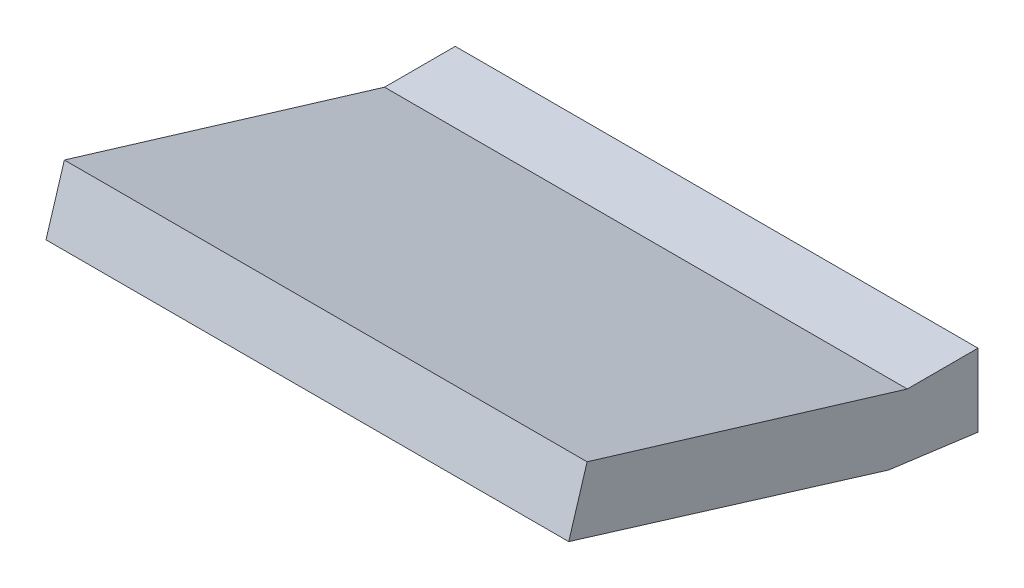
ISO-10303-21;
HEADER;
FILE_DESCRIPTION(('STEP AP214'),'2;1');
FILE_NAME('part.step','',(''),(''),'','','');
FILE_SCHEMA(('AUTOMOTIVE_DESIGN { 1 0 10303 214 1 1 1 1 }'));
ENDSEC;
DATA;
#1=APPLICATION_CONTEXT('core data for automotive mechanical design processes');
#2=APPLICATION_PROTOCOL_DEFINITION('international standard','automotive_design',2000,#1);
#3=PRODUCT_CONTEXT('',#1,'mechanical');
#4=PRODUCT('Part','Part','',(#3));
#5=PRODUCT_RELATED_PRODUCT_CATEGORY('part','',(#4));
#6=PRODUCT_DEFINITION_FORMATION('','',#4);
#7=PRODUCT_DEFINITION_CONTEXT('part definition',#1,'design');
#8=PRODUCT_DEFINITION('design','',#6,#7);
#9=PRODUCT_DEFINITION_SHAPE('','',#8);
#10=(LENGTH_UNIT() NAMED_UNIT(*) SI_UNIT(.MILLI.,.METRE.));
#11=(NAMED_UNIT(*) PLANE_ANGLE_UNIT() SI_UNIT($,.RADIAN.));
#12=(NAMED_UNIT(*) SI_UNIT($,.STERADIAN.) SOLID_ANGLE_UNIT());
#13=UNCERTAINTY_MEASURE_WITH_UNIT(LENGTH_MEASURE(1.E-05),#10,'distance_accuracy_value','');
#14=(GEOMETRIC_REPRESENTATION_CONTEXT(3) GLOBAL_UNCERTAINTY_ASSIGNED_CONTEXT((#13)) GLOBAL_UNIT_ASSIGNED_CONTEXT((#10,
#11,#12)) REPRESENTATION_CONTEXT('',''));
#15=CARTESIAN_POINT('',(0.,0.,0.));
#16=DIRECTION('',(0.,0.,1.));
#17=DIRECTION('',(1.,0.,0.));
#18=AXIS2_PLACEMENT_3D('',#15,#16,#17);
#19=CARTESIAN_POINT('',(31.75,0.,0.));
#20=DIRECTION('',(0.,-0.957016299288306,0.290034140915368));
#21=DIRECTION('',(0.,-0.290034140915368,-0.957016299288306));
#22=AXIS2_PLACEMENT_3D('',#19,#20,#21);
#23=PLANE('',#22);
#24=DIRECTION('',(0.,0.290034140915368,0.957016299288306));
#25=VECTOR('',#24,1.);
#26=CARTESIAN_POINT('',(0.,0.,0.));
#27=LINE('',#26,#25);
#28=CARTESIAN_POINT('',(0.,0.,0.));
#29=VERTEX_POINT('',#28);
#30=CARTESIAN_POINT('',(0.,5.89349374340027,19.4465712015384));
#31=VERTEX_POINT('',#30);
#32=EDGE_CURVE('E119',#29,#31,#27,.T.);
#33=ORIENTED_EDGE('',*,*,#32,.T.);
#34=DIRECTION('',(-1.,0.,0.));
#35=VECTOR('',#34,1.);
#36=CARTESIAN_POINT('',(31.75,5.89349374340027,19.4465712015384));
#37=LINE('',#36,#35);
#38=CARTESIAN_POINT('',(31.75,5.89349374340027,19.4465712015384));
#39=VERTEX_POINT('',#38);
#40=EDGE_CURVE('E11',#39,#31,#37,.T.);
#41=ORIENTED_EDGE('',*,*,#40,.F.);
#42=DIRECTION('',(0.,0.290034140915368,0.957016299288306));
#43=VECTOR('',#42,1.);
#44=CARTESIAN_POINT('',(31.75,0.,0.));
#45=LINE('',#44,#43);
#46=CARTESIAN_POINT('',(31.75,0.,0.));
#47=VERTEX_POINT('',#46);
#48=EDGE_CURVE('E54',#47,#39,#45,.T.);
#49=ORIENTED_EDGE('',*,*,#48,.F.);
#50=DIRECTION('',(-1.,0.,0.));
#51=VECTOR('',#50,1.);
#52=CARTESIAN_POINT('',(31.75,0.,0.));
#53=LINE('',#52,#51);
#54=EDGE_CURVE('E73',#47,#29,#53,.T.);
#55=ORIENTED_EDGE('',*,*,#54,.T.);
#56=EDGE_LOOP('',(#33,#41,#49,#55));
#57=FACE_BOUND('',#56,.T.);
#58=ADVANCED_FACE('F38',(#57),#23,.F.);
#59=CARTESIAN_POINT('',(31.75,5.89349374340027,19.4465712015384));
#60=DIRECTION('',(0.,-0.292700853705509,-0.956204063074439));
#61=DIRECTION('',(0.,0.95620406307444,-0.292700853705509));
#62=AXIS2_PLACEMENT_3D('',#59,#60,#61);
#63=PLANE('',#62);
#64=DIRECTION('',(0.,-0.956204063074439,0.292700853705509));
#65=VECTOR('',#64,1.);
#66=CARTESIAN_POINT('',(0.,5.89349374340027,19.4465712015384));
#67=LINE('',#66,#65);
#68=CARTESIAN_POINT('',(0.,2.25035626308666,20.5617614541564));
#69=VERTEX_POINT('',#68);
#70=EDGE_CURVE('E68',#31,#69,#67,.T.);
#71=ORIENTED_EDGE('',*,*,#70,.T.);
#72=DIRECTION('',(-1.,0.,0.));
#73=VECTOR('',#72,1.);
#74=CARTESIAN_POINT('',(31.75,2.25035626308666,20.5617614541564));
#75=LINE('',#74,#73);
#76=CARTESIAN_POINT('',(31.75,2.25035626308666,20.5617614541564));
#77=VERTEX_POINT('',#76);
#78=EDGE_CURVE('E46',#77,#69,#75,.T.);
#79=ORIENTED_EDGE('',*,*,#78,.F.);
#80=DIRECTION('',(0.,-0.956204063074439,0.292700853705509));
#81=VECTOR('',#80,1.);
#82=CARTESIAN_POINT('',(31.75,5.89349374340027,19.4465712015384));
#83=LINE('',#82,#81);
#84=EDGE_CURVE('E78',#39,#77,#83,.T.);
#85=ORIENTED_EDGE('',*,*,#84,.F.);
#86=ORIENTED_EDGE('',*,*,#40,.T.);
#87=EDGE_LOOP('',(#71,#79,#85,#86));
#88=FACE_BOUND('',#87,.T.);
#89=ADVANCED_FACE('F148',(#88),#63,.F.);
#90=CARTESIAN_POINT('',(31.75,2.25035626308666,20.5617614541564));
#91=DIRECTION('',(0.,0.95620406307444,-0.292700853705508));
#92=DIRECTION('',(0.,0.292700853705508,0.95620406307444));
#93=AXIS2_PLACEMENT_3D('',#90,#91,#92);
#94=PLANE('',#93);
#95=DIRECTION('',(0.,-0.292700853705508,-0.956204063074439));
#96=VECTOR('',#95,1.);
#97=CARTESIAN_POINT('',(0.,2.25035626308666,20.5617614541564));
#98=LINE('',#97,#96);
#99=CARTESIAN_POINT('',(0.,-3.69732508420927,1.13169489248376));
#100=VERTEX_POINT('',#99);
#101=EDGE_CURVE('E111',#69,#100,#98,.T.);
#102=ORIENTED_EDGE('',*,*,#101,.T.);
#103=DIRECTION('',(-1.,0.,0.));
#104=VECTOR('',#103,1.);
#105=CARTESIAN_POINT('',(31.75,-3.69732508420927,1.13169489248376));
#106=LINE('',#105,#104);
#107=CARTESIAN_POINT('',(31.75,-3.69732508420927,1.13169489248376));
#108=VERTEX_POINT('',#107);
#109=EDGE_CURVE('E95',#108,#100,#106,.T.);
#110=ORIENTED_EDGE('',*,*,#109,.F.);
#111=DIRECTION('',(0.,-0.292700853705508,-0.956204063074439));
#112=VECTOR('',#111,1.);
#113=CARTESIAN_POINT('',(31.75,2.25035626308666,20.5617614541564));
#114=LINE('',#113,#112);
#115=EDGE_CURVE('E123',#77,#108,#114,.T.);
#116=ORIENTED_EDGE('',*,*,#115,.F.);
#117=ORIENTED_EDGE('',*,*,#78,.T.);
#118=EDGE_LOOP('',(#102,#110,#116,#117));
#119=FACE_BOUND('',#118,.T.);
#120=ADVANCED_FACE('F116',(#119),#94,.F.);
#121=CARTESIAN_POINT('',(31.75,0.,0.));
#122=DIRECTION('',(1.,0.,0.));
#123=DIRECTION('',(0.,0.,-1.));
#124=AXIS2_PLACEMENT_3D('',#121,#122,#123);
#125=PLANE('',#124);
#126=DIRECTION('',(0.,0.132172696929109,0.991226703729518));
#127=VECTOR('',#126,1.);
#128=CARTESIAN_POINT('',(31.75,-3.78100107696743,0.504168327542374));
#129=LINE('',#128,#127);
#130=CARTESIAN_POINT('',(31.75,-4.42095910010621,-4.29518506797274));
#131=VERTEX_POINT('',#130);
#132=EDGE_CURVE('E101',#131,#108,#129,.T.);
#133=ORIENTED_EDGE('',*,*,#132,.F.);
#134=DIRECTION('',(0.,1.,0.));
#135=VECTOR('',#134,1.);
#136=CARTESIAN_POINT('',(31.75,0.,-4.29518506797274));
#137=LINE('',#136,#135);
#138=CARTESIAN_POINT('',(31.75,0.,-4.29518506797274));
#139=VERTEX_POINT('',#138);
#140=EDGE_CURVE('E129',#131,#139,#137,.T.);
#141=ORIENTED_EDGE('',*,*,#140,.T.);
#142=DIRECTION('',(0.,0.,1.));
#143=VECTOR('',#142,1.);
#144=CARTESIAN_POINT('',(31.75,0.,0.));
#145=LINE('',#144,#143);
#146=EDGE_CURVE('E135',#139,#47,#145,.T.);
#147=ORIENTED_EDGE('',*,*,#146,.T.);
#148=ORIENTED_EDGE('',*,*,#48,.T.);
#149=ORIENTED_EDGE('',*,*,#84,.T.);
#150=ORIENTED_EDGE('',*,*,#115,.T.);
#151=EDGE_LOOP('',(#133,#141,#147,#148,#149,#150));
#152=FACE_BOUND('',#151,.T.);
#153=ADVANCED_FACE('F146',(#152),#125,.T.);
#154=CARTESIAN_POINT('',(0.,0.,0.));
#155=DIRECTION('',(1.,0.,0.));
#156=DIRECTION('',(0.,0.,-1.));
#157=AXIS2_PLACEMENT_3D('',#154,#155,#156);
#158=PLANE('',#157);
#159=DIRECTION('',(0.,1.,0.));
#160=VECTOR('',#159,1.);
#161=CARTESIAN_POINT('',(0.,0.,-4.29518506797274));
#162=LINE('',#161,#160);
#163=CARTESIAN_POINT('',(0.,-4.42095910010621,-4.29518506797274));
#164=VERTEX_POINT('',#163);
#165=CARTESIAN_POINT('',(0.,0.,-4.29518506797274));
#166=VERTEX_POINT('',#165);
#167=EDGE_CURVE('E113',#164,#166,#162,.T.);
#168=ORIENTED_EDGE('',*,*,#167,.F.);
#169=DIRECTION('',(0.,-0.132172696929109,-0.991226703729518));
#170=VECTOR('',#169,1.);
#171=CARTESIAN_POINT('',(0.,-3.69732508420927,1.13169489248376));
#172=LINE('',#171,#170);
#173=EDGE_CURVE('E98',#100,#164,#172,.T.);
#174=ORIENTED_EDGE('',*,*,#173,.F.);
#175=ORIENTED_EDGE('',*,*,#101,.F.);
#176=ORIENTED_EDGE('',*,*,#70,.F.);
#177=ORIENTED_EDGE('',*,*,#32,.F.);
#178=DIRECTION('',(0.,0.,1.));
#179=VECTOR('',#178,1.);
#180=CARTESIAN_POINT('',(0.,0.,0.));
#181=LINE('',#180,#179);
#182=EDGE_CURVE('E139',#166,#29,#181,.T.);
#183=ORIENTED_EDGE('',*,*,#182,.F.);
#184=EDGE_LOOP('',(#168,#174,#175,#176,#177,#183));
#185=FACE_BOUND('',#184,.T.);
#186=ADVANCED_FACE('F110',(#185),#158,.F.);
#187=CARTESIAN_POINT('',(31.75,0.,0.));
#188=DIRECTION('',(0.,-1.,0.));
#189=DIRECTION('',(0.,0.,-1.));
#190=AXIS2_PLACEMENT_3D('',#187,#188,#189);
#191=PLANE('',#190);
#192=ORIENTED_EDGE('',*,*,#182,.T.);
#193=ORIENTED_EDGE('',*,*,#54,.F.);
#194=ORIENTED_EDGE('',*,*,#146,.F.);
#195=DIRECTION('',(-1.,0.,0.));
#196=VECTOR('',#195,1.);
#197=CARTESIAN_POINT('',(31.75,0.,-4.29518506797274));
#198=LINE('',#197,#196);
#199=EDGE_CURVE('E127',#139,#166,#198,.T.);
#200=ORIENTED_EDGE('',*,*,#199,.T.);
#201=EDGE_LOOP('',(#192,#193,#194,#200));
#202=FACE_BOUND('',#201,.T.);
#203=ADVANCED_FACE('F147',(#202),#191,.F.);
#204=CARTESIAN_POINT('',(31.75,0.,-4.29518506797274));
#205=DIRECTION('',(0.,0.,1.));
#206=DIRECTION('',(1.,0.,0.));
#207=AXIS2_PLACEMENT_3D('',#204,#205,#206);
#208=PLANE('',#207);
#209=ORIENTED_EDGE('',*,*,#140,.F.);
#210=DIRECTION('',(-1.,0.,0.));
#211=VECTOR('',#210,1.);
#212=CARTESIAN_POINT('',(39.116,-4.42095910010621,-4.29518506797274));
#213=LINE('',#212,#211);
#214=EDGE_CURVE('E114',#131,#164,#213,.T.);
#215=ORIENTED_EDGE('',*,*,#214,.T.);
#216=ORIENTED_EDGE('',*,*,#167,.T.);
#217=ORIENTED_EDGE('',*,*,#199,.F.);
#218=EDGE_LOOP('',(#209,#215,#216,#217));
#219=FACE_BOUND('',#218,.T.);
#220=ADVANCED_FACE('F145',(#219),#208,.F.);
#221=CARTESIAN_POINT('',(39.116,-3.69732508420927,1.13169489248376));
#222=DIRECTION('',(0.,0.991226703729518,-0.132172696929109));
#223=DIRECTION('',(0.,0.132172696929109,0.991226703729518));
#224=AXIS2_PLACEMENT_3D('',#221,#222,#223);
#225=PLANE('',#224);
#226=ORIENTED_EDGE('',*,*,#132,.T.);
#227=ORIENTED_EDGE('',*,*,#109,.T.);
#228=ORIENTED_EDGE('',*,*,#173,.T.);
#229=ORIENTED_EDGE('',*,*,#214,.F.);
#230=EDGE_LOOP('',(#226,#227,#228,#229));
#231=FACE_BOUND('',#230,.T.);
#232=ADVANCED_FACE('F97',(#231),#225,.F.);
#233=CLOSED_SHELL('',(#58,#89,#120,#153,#186,#203,#220,#232));
#234=MANIFOLD_SOLID_BREP('B2',#233);
#235=ADVANCED_BREP_SHAPE_REPRESENTATION('',(#18,#234),#14);
#236=SHAPE_DEFINITION_REPRESENTATION(#9,#235);
ENDSEC;
END-ISO-10303-21;
